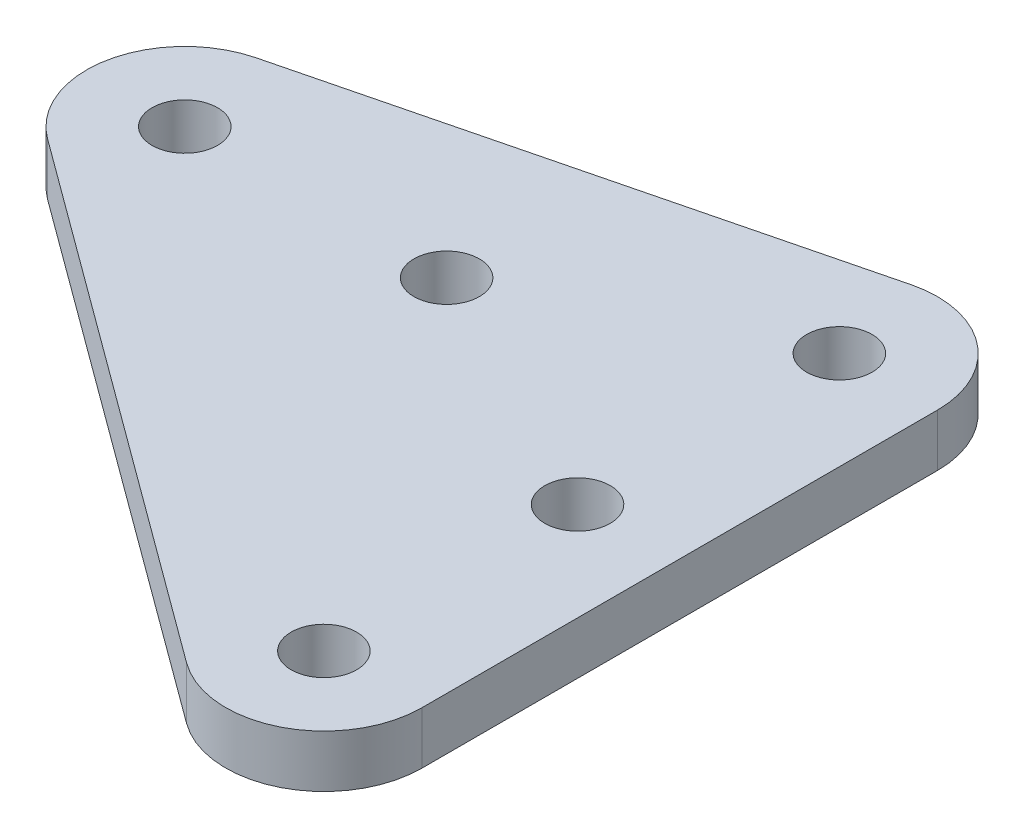
ISO-10303-21;
HEADER;
FILE_DESCRIPTION(('STEP AP214'),'2;1');
FILE_NAME('part.step','',(''),(''),'','','');
FILE_SCHEMA(('AUTOMOTIVE_DESIGN { 1 0 10303 214 1 1 1 1 }'));
ENDSEC;
DATA;
#1=APPLICATION_CONTEXT('core data for automotive mechanical design processes');
#2=APPLICATION_PROTOCOL_DEFINITION('international standard','automotive_design',2000,#1);
#3=PRODUCT_CONTEXT('',#1,'mechanical');
#4=PRODUCT('Part','Part','',(#3));
#5=PRODUCT_RELATED_PRODUCT_CATEGORY('part','',(#4));
#6=PRODUCT_DEFINITION_FORMATION('','',#4);
#7=PRODUCT_DEFINITION_CONTEXT('part definition',#1,'design');
#8=PRODUCT_DEFINITION('design','',#6,#7);
#9=PRODUCT_DEFINITION_SHAPE('','',#8);
#10=(LENGTH_UNIT() NAMED_UNIT(*) SI_UNIT(.MILLI.,.METRE.));
#11=(NAMED_UNIT(*) PLANE_ANGLE_UNIT() SI_UNIT($,.RADIAN.));
#12=(NAMED_UNIT(*) SI_UNIT($,.STERADIAN.) SOLID_ANGLE_UNIT());
#13=UNCERTAINTY_MEASURE_WITH_UNIT(LENGTH_MEASURE(1.E-05),#10,'distance_accuracy_value','');
#14=(GEOMETRIC_REPRESENTATION_CONTEXT(3) GLOBAL_UNCERTAINTY_ASSIGNED_CONTEXT((#13)) GLOBAL_UNIT_ASSIGNED_CONTEXT((#10,
#11,#12)) REPRESENTATION_CONTEXT('',''));
#15=CARTESIAN_POINT('',(0.,0.,0.));
#16=DIRECTION('',(0.,0.,1.));
#17=DIRECTION('',(1.,0.,0.));
#18=AXIS2_PLACEMENT_3D('',#15,#16,#17);
#19=CARTESIAN_POINT('',(13.5400431139798,4.,-19.6875573394978));
#20=DIRECTION('',(0.,1.,0.));
#21=DIRECTION('',(0.,0.,1.));
#22=AXIS2_PLACEMENT_3D('',#19,#20,#21);
#23=PLANE('',#22);
#24=CARTESIAN_POINT('',(13.5400431139798,4.,0.312442660502191));
#25=DIRECTION('',(0.,1.,0.));
#26=DIRECTION('',(0.,0.,-1.));
#27=AXIS2_PLACEMENT_3D('',#24,#25,#26);
#28=CIRCLE('',#27,2.5);
#29=CARTESIAN_POINT('',(13.5400431139798,4.,-2.1875573394978));
#30=VERTEX_POINT('',#29);
#31=EDGE_CURVE('E196',#30,#30,#28,.T.);
#32=ORIENTED_EDGE('',*,*,#31,.F.);
#33=EDGE_LOOP('',(#32));
#34=FACE_BOUND('',#33,.T.);
#35=CARTESIAN_POINT('',(-6.45995688602022,4.,-9.6875573394978));
#36=DIRECTION('',(0.,1.,0.));
#37=DIRECTION('',(0.,0.,1.));
#38=AXIS2_PLACEMENT_3D('',#35,#36,#37);
#39=CIRCLE('',#38,2.50000000000001);
#40=CARTESIAN_POINT('',(-6.45995688602022,4.,-7.1875573394978));
#41=VERTEX_POINT('',#40);
#42=EDGE_CURVE('E208',#41,#41,#39,.T.);
#43=ORIENTED_EDGE('',*,*,#42,.F.);
#44=EDGE_LOOP('',(#43));
#45=FACE_BOUND('',#44,.T.);
#46=CARTESIAN_POINT('',(13.5400431139798,4.,-19.6875573394978));
#47=DIRECTION('',(0.,1.,0.));
#48=DIRECTION('',(0.,0.,1.));
#49=AXIS2_PLACEMENT_3D('',#46,#47,#48);
#50=CIRCLE('',#49,7.50000000000003);
#51=CARTESIAN_POINT('',(21.0400431139798,4.,-19.6875573394978));
#52=VERTEX_POINT('',#51);
#53=CARTESIAN_POINT('',(11.7210259262073,4.,-26.9636260905878));
#54=VERTEX_POINT('',#53);
#55=EDGE_CURVE('E132',#52,#54,#50,.T.);
#56=ORIENTED_EDGE('',*,*,#55,.T.);
#57=DIRECTION('',(-0.970142500145332,0.,0.242535625036333));
#58=VECTOR('',#57,1.);
#59=CARTESIAN_POINT('',(-28.2789740737927,4.,-16.9636260905878));
#60=LINE('',#59,#58);
#61=CARTESIAN_POINT('',(-28.2789740737927,4.,-16.9636260905878));
#62=VERTEX_POINT('',#61);
#63=EDGE_CURVE('E90',#54,#62,#60,.T.);
#64=ORIENTED_EDGE('',*,*,#63,.T.);
#65=CARTESIAN_POINT('',(-26.4599568860202,4.,-9.6875573394978));
#66=DIRECTION('',(0.,1.,0.));
#67=DIRECTION('',(0.,0.,1.));
#68=AXIS2_PLACEMENT_3D('',#65,#66,#67);
#69=CIRCLE('',#68,7.50000000000001);
#70=CARTESIAN_POINT('',(-30.8992894167607,4.,-3.64253238657085));
#71=VERTEX_POINT('',#70);
#72=EDGE_CURVE('E103',#62,#71,#69,.T.);
#73=ORIENTED_EDGE('',*,*,#72,.T.);
#74=DIRECTION('',(0.806003327056926,0.,0.59191100409873));
#75=VECTOR('',#74,1.);
#76=CARTESIAN_POINT('',(-30.8992894167607,4.,-3.64253238657086));
#77=LINE('',#76,#75);
#78=CARTESIAN_POINT('',(9.10071058323932,4.,25.7325822924248));
#79=VERTEX_POINT('',#78);
#80=EDGE_CURVE('E97',#71,#79,#77,.T.);
#81=ORIENTED_EDGE('',*,*,#80,.T.);
#82=CARTESIAN_POINT('',(13.5400431139798,4.,19.6875573394978));
#83=DIRECTION('',(0.,1.,0.));
#84=DIRECTION('',(0.,0.,1.));
#85=AXIS2_PLACEMENT_3D('',#82,#83,#84);
#86=CIRCLE('',#85,7.50000000000001);
#87=CARTESIAN_POINT('',(21.0400431139798,4.,19.6875573394978));
#88=VERTEX_POINT('',#87);
#89=EDGE_CURVE('E101',#79,#88,#86,.T.);
#90=ORIENTED_EDGE('',*,*,#89,.T.);
#91=DIRECTION('',(0.,0.,-1.));
#92=VECTOR('',#91,1.);
#93=CARTESIAN_POINT('',(21.0400431139798,4.,-19.6875573394978));
#94=LINE('',#93,#92);
#95=EDGE_CURVE('E53',#88,#52,#94,.T.);
#96=ORIENTED_EDGE('',*,*,#95,.T.);
#97=EDGE_LOOP('',(#56,#64,#73,#81,#90,#96));
#98=FACE_BOUND('',#97,.T.);
#99=CARTESIAN_POINT('',(-26.4599568860202,4.,-9.6875573394978));
#100=DIRECTION('',(0.,1.,0.));
#101=DIRECTION('',(0.,0.,1.));
#102=AXIS2_PLACEMENT_3D('',#99,#100,#101);
#103=CIRCLE('',#102,2.5);
#104=CARTESIAN_POINT('',(-26.4599568860202,4.,-7.18755733949781));
#105=VERTEX_POINT('',#104);
#106=EDGE_CURVE('E125',#105,#105,#103,.T.);
#107=ORIENTED_EDGE('',*,*,#106,.F.);
#108=EDGE_LOOP('',(#107));
#109=FACE_BOUND('',#108,.T.);
#110=CARTESIAN_POINT('',(13.5400431139798,4.,-19.6875573394978));
#111=DIRECTION('',(0.,1.,0.));
#112=DIRECTION('',(0.,0.,1.));
#113=AXIS2_PLACEMENT_3D('',#110,#111,#112);
#114=CIRCLE('',#113,2.5);
#115=CARTESIAN_POINT('',(13.5400431139798,4.,-17.1875573394978));
#116=VERTEX_POINT('',#115);
#117=EDGE_CURVE('E202',#116,#116,#114,.T.);
#118=ORIENTED_EDGE('',*,*,#117,.F.);
#119=EDGE_LOOP('',(#118));
#120=FACE_BOUND('',#119,.T.);
#121=CARTESIAN_POINT('',(13.5400431139798,4.,19.6875573394978));
#122=DIRECTION('',(0.,1.,0.));
#123=DIRECTION('',(0.,0.,1.));
#124=AXIS2_PLACEMENT_3D('',#121,#122,#123);
#125=CIRCLE('',#124,2.5);
#126=CARTESIAN_POINT('',(13.5400431139798,4.,22.1875573394978));
#127=VERTEX_POINT('',#126);
#128=EDGE_CURVE('E187',#127,#127,#125,.T.);
#129=ORIENTED_EDGE('',*,*,#128,.F.);
#130=EDGE_LOOP('',(#129));
#131=FACE_BOUND('',#130,.T.);
#132=ADVANCED_FACE('F36',(#34,#45,#98,#109,#120,#131),#23,.T.);
#133=CARTESIAN_POINT('',(13.5400431139798,0.,-19.6875573394978));
#134=DIRECTION('',(0.,1.,0.));
#135=DIRECTION('',(0.,0.,1.));
#136=AXIS2_PLACEMENT_3D('',#133,#134,#135);
#137=PLANE('',#136);
#138=CARTESIAN_POINT('',(13.5400431139798,0.,-19.6875573394978));
#139=DIRECTION('',(0.,1.,0.));
#140=DIRECTION('',(0.,0.,1.));
#141=AXIS2_PLACEMENT_3D('',#138,#139,#140);
#142=CIRCLE('',#141,7.50000000000003);
#143=CARTESIAN_POINT('',(21.0400431139798,0.,-19.6875573394978));
#144=VERTEX_POINT('',#143);
#145=CARTESIAN_POINT('',(11.7210259262073,0.,-26.9636260905878));
#146=VERTEX_POINT('',#145);
#147=EDGE_CURVE('E121',#144,#146,#142,.T.);
#148=ORIENTED_EDGE('',*,*,#147,.F.);
#149=DIRECTION('',(0.,0.,-1.));
#150=VECTOR('',#149,1.);
#151=CARTESIAN_POINT('',(21.0400431139798,0.,-19.6875573394978));
#152=LINE('',#151,#150);
#153=CARTESIAN_POINT('',(21.0400431139798,0.,19.6875573394978));
#154=VERTEX_POINT('',#153);
#155=EDGE_CURVE('E82',#154,#144,#152,.T.);
#156=ORIENTED_EDGE('',*,*,#155,.F.);
#157=CARTESIAN_POINT('',(13.5400431139798,0.,19.6875573394978));
#158=DIRECTION('',(0.,1.,0.));
#159=DIRECTION('',(0.,0.,1.));
#160=AXIS2_PLACEMENT_3D('',#157,#158,#159);
#161=CIRCLE('',#160,7.50000000000001);
#162=CARTESIAN_POINT('',(9.10071058323932,0.,25.7325822924248));
#163=VERTEX_POINT('',#162);
#164=EDGE_CURVE('E76',#163,#154,#161,.T.);
#165=ORIENTED_EDGE('',*,*,#164,.F.);
#166=DIRECTION('',(0.806003327056926,0.,0.59191100409873));
#167=VECTOR('',#166,1.);
#168=CARTESIAN_POINT('',(-30.8992894167607,0.,-3.64253238657086));
#169=LINE('',#168,#167);
#170=CARTESIAN_POINT('',(-30.8992894167607,0.,-3.64253238657085));
#171=VERTEX_POINT('',#170);
#172=EDGE_CURVE('E111',#171,#163,#169,.T.);
#173=ORIENTED_EDGE('',*,*,#172,.F.);
#174=CARTESIAN_POINT('',(-26.4599568860202,0.,-9.6875573394978));
#175=DIRECTION('',(0.,1.,0.));
#176=DIRECTION('',(0.,0.,1.));
#177=AXIS2_PLACEMENT_3D('',#174,#175,#176);
#178=CIRCLE('',#177,7.50000000000001);
#179=CARTESIAN_POINT('',(-28.2789740737927,0.,-16.9636260905878));
#180=VERTEX_POINT('',#179);
#181=EDGE_CURVE('E127',#180,#171,#178,.T.);
#182=ORIENTED_EDGE('',*,*,#181,.F.);
#183=DIRECTION('',(-0.970142500145332,0.,0.242535625036333));
#184=VECTOR('',#183,1.);
#185=CARTESIAN_POINT('',(-28.2789740737927,0.,-16.9636260905878));
#186=LINE('',#185,#184);
#187=EDGE_CURVE('E124',#146,#180,#186,.T.);
#188=ORIENTED_EDGE('',*,*,#187,.F.);
#189=EDGE_LOOP('',(#148,#156,#165,#173,#182,#188));
#190=FACE_BOUND('',#189,.T.);
#191=CARTESIAN_POINT('',(-26.4599568860202,0.,-9.6875573394978));
#192=DIRECTION('',(0.,1.,0.));
#193=DIRECTION('',(0.,0.,1.));
#194=AXIS2_PLACEMENT_3D('',#191,#192,#193);
#195=CIRCLE('',#194,2.5);
#196=CARTESIAN_POINT('',(-26.4599568860202,0.,-7.18755733949781));
#197=VERTEX_POINT('',#196);
#198=EDGE_CURVE('E211',#197,#197,#195,.T.);
#199=ORIENTED_EDGE('',*,*,#198,.T.);
#200=EDGE_LOOP('',(#199));
#201=FACE_BOUND('',#200,.T.);
#202=CARTESIAN_POINT('',(-6.45995688602022,0.,-9.6875573394978));
#203=DIRECTION('',(0.,1.,0.));
#204=DIRECTION('',(0.,0.,1.));
#205=AXIS2_PLACEMENT_3D('',#202,#203,#204);
#206=CIRCLE('',#205,2.50000000000001);
#207=CARTESIAN_POINT('',(-6.45995688602022,0.,-7.1875573394978));
#208=VERTEX_POINT('',#207);
#209=EDGE_CURVE('E205',#208,#208,#206,.T.);
#210=ORIENTED_EDGE('',*,*,#209,.T.);
#211=EDGE_LOOP('',(#210));
#212=FACE_BOUND('',#211,.T.);
#213=CARTESIAN_POINT('',(13.5400431139798,0.,-19.6875573394978));
#214=DIRECTION('',(0.,1.,0.));
#215=DIRECTION('',(0.,0.,1.));
#216=AXIS2_PLACEMENT_3D('',#213,#214,#215);
#217=CIRCLE('',#216,2.5);
#218=CARTESIAN_POINT('',(13.5400431139798,0.,-17.1875573394978));
#219=VERTEX_POINT('',#218);
#220=EDGE_CURVE('E199',#219,#219,#217,.T.);
#221=ORIENTED_EDGE('',*,*,#220,.T.);
#222=EDGE_LOOP('',(#221));
#223=FACE_BOUND('',#222,.T.);
#224=CARTESIAN_POINT('',(13.5400431139798,0.,0.312442660502191));
#225=DIRECTION('',(0.,1.,0.));
#226=DIRECTION('',(0.,0.,-1.));
#227=AXIS2_PLACEMENT_3D('',#224,#225,#226);
#228=CIRCLE('',#227,2.5);
#229=CARTESIAN_POINT('',(13.5400431139798,0.,-2.1875573394978));
#230=VERTEX_POINT('',#229);
#231=EDGE_CURVE('E193',#230,#230,#228,.T.);
#232=ORIENTED_EDGE('',*,*,#231,.T.);
#233=EDGE_LOOP('',(#232));
#234=FACE_BOUND('',#233,.T.);
#235=CARTESIAN_POINT('',(13.5400431139798,0.,19.6875573394978));
#236=DIRECTION('',(0.,1.,0.));
#237=DIRECTION('',(0.,0.,1.));
#238=AXIS2_PLACEMENT_3D('',#235,#236,#237);
#239=CIRCLE('',#238,2.5);
#240=CARTESIAN_POINT('',(13.5400431139798,0.,22.1875573394978));
#241=VERTEX_POINT('',#240);
#242=EDGE_CURVE('E190',#241,#241,#239,.T.);
#243=ORIENTED_EDGE('',*,*,#242,.T.);
#244=EDGE_LOOP('',(#243));
#245=FACE_BOUND('',#244,.T.);
#246=ADVANCED_FACE('F141',(#190,#201,#212,#223,#234,#245),#137,.F.);
#247=CARTESIAN_POINT('',(13.5400431139798,4.,-19.6875573394978));
#248=DIRECTION('',(0.,-1.,0.));
#249=DIRECTION('',(0.,0.,-1.));
#250=AXIS2_PLACEMENT_3D('',#247,#248,#249);
#251=CYLINDRICAL_SURFACE('',#250,7.50000000000003);
#252=ORIENTED_EDGE('',*,*,#147,.T.);
#253=DIRECTION('',(0.,-1.,0.));
#254=VECTOR('',#253,1.);
#255=CARTESIAN_POINT('',(11.7210259262073,4.,-26.9636260905878));
#256=LINE('',#255,#254);
#257=EDGE_CURVE('E11',#54,#146,#256,.T.);
#258=ORIENTED_EDGE('',*,*,#257,.F.);
#259=ORIENTED_EDGE('',*,*,#55,.F.);
#260=DIRECTION('',(0.,-1.,0.));
#261=VECTOR('',#260,1.);
#262=CARTESIAN_POINT('',(21.0400431139798,4.,-19.6875573394978));
#263=LINE('',#262,#261);
#264=EDGE_CURVE('E117',#52,#144,#263,.T.);
#265=ORIENTED_EDGE('',*,*,#264,.T.);
#266=EDGE_LOOP('',(#252,#258,#259,#265));
#267=FACE_BOUND('',#266,.T.);
#268=ADVANCED_FACE('F38',(#267),#251,.T.);
#269=CARTESIAN_POINT('',(-28.2789740737927,4.,-16.9636260905878));
#270=DIRECTION('',(0.242535625036333,0.,0.970142500145332));
#271=DIRECTION('',(0.970142500145332,0.,-0.242535625036333));
#272=AXIS2_PLACEMENT_3D('',#269,#270,#271);
#273=PLANE('',#272);
#274=ORIENTED_EDGE('',*,*,#187,.T.);
#275=DIRECTION('',(0.,-1.,0.));
#276=VECTOR('',#275,1.);
#277=CARTESIAN_POINT('',(-28.2789740737927,4.,-16.9636260905878));
#278=LINE('',#277,#276);
#279=EDGE_CURVE('E45',#62,#180,#278,.T.);
#280=ORIENTED_EDGE('',*,*,#279,.F.);
#281=ORIENTED_EDGE('',*,*,#63,.F.);
#282=ORIENTED_EDGE('',*,*,#257,.T.);
#283=EDGE_LOOP('',(#274,#280,#281,#282));
#284=FACE_BOUND('',#283,.T.);
#285=ADVANCED_FACE('F278',(#284),#273,.F.);
#286=CARTESIAN_POINT('',(-26.4599568860202,4.,-9.6875573394978));
#287=DIRECTION('',(0.,-1.,0.));
#288=DIRECTION('',(0.,0.,-1.));
#289=AXIS2_PLACEMENT_3D('',#286,#287,#288);
#290=CYLINDRICAL_SURFACE('',#289,7.50000000000001);
#291=ORIENTED_EDGE('',*,*,#181,.T.);
#292=DIRECTION('',(0.,-1.,0.));
#293=VECTOR('',#292,1.);
#294=CARTESIAN_POINT('',(-30.8992894167607,4.,-3.64253238657085));
#295=LINE('',#294,#293);
#296=EDGE_CURVE('E112',#71,#171,#295,.T.);
#297=ORIENTED_EDGE('',*,*,#296,.F.);
#298=ORIENTED_EDGE('',*,*,#72,.F.);
#299=ORIENTED_EDGE('',*,*,#279,.T.);
#300=EDGE_LOOP('',(#291,#297,#298,#299));
#301=FACE_BOUND('',#300,.T.);
#302=ADVANCED_FACE('F138',(#301),#290,.T.);
#303=CARTESIAN_POINT('',(-30.8992894167607,4.,-3.64253238657086));
#304=DIRECTION('',(0.59191100409873,0.,-0.806003327056925));
#305=DIRECTION('',(-0.806003327056925,0.,-0.59191100409873));
#306=AXIS2_PLACEMENT_3D('',#303,#304,#305);
#307=PLANE('',#306);
#308=ORIENTED_EDGE('',*,*,#172,.T.);
#309=DIRECTION('',(0.,-1.,0.));
#310=VECTOR('',#309,1.);
#311=CARTESIAN_POINT('',(9.10071058323932,4.,25.7325822924248));
#312=LINE('',#311,#310);
#313=EDGE_CURVE('E108',#79,#163,#312,.T.);
#314=ORIENTED_EDGE('',*,*,#313,.F.);
#315=ORIENTED_EDGE('',*,*,#80,.F.);
#316=ORIENTED_EDGE('',*,*,#296,.T.);
#317=EDGE_LOOP('',(#308,#314,#315,#316));
#318=FACE_BOUND('',#317,.T.);
#319=ADVANCED_FACE('F109',(#318),#307,.F.);
#320=CARTESIAN_POINT('',(13.5400431139798,4.,19.6875573394978));
#321=DIRECTION('',(0.,-1.,0.));
#322=DIRECTION('',(0.,0.,-1.));
#323=AXIS2_PLACEMENT_3D('',#320,#321,#322);
#324=CYLINDRICAL_SURFACE('',#323,7.50000000000001);
#325=ORIENTED_EDGE('',*,*,#164,.T.);
#326=DIRECTION('',(0.,-1.,0.));
#327=VECTOR('',#326,1.);
#328=CARTESIAN_POINT('',(21.0400431139798,4.,19.6875573394978));
#329=LINE('',#328,#327);
#330=EDGE_CURVE('E113',#88,#154,#329,.T.);
#331=ORIENTED_EDGE('',*,*,#330,.F.);
#332=ORIENTED_EDGE('',*,*,#89,.F.);
#333=ORIENTED_EDGE('',*,*,#313,.T.);
#334=EDGE_LOOP('',(#325,#331,#332,#333));
#335=FACE_BOUND('',#334,.T.);
#336=ADVANCED_FACE('F115',(#335),#324,.T.);
#337=CARTESIAN_POINT('',(21.0400431139798,4.,-19.6875573394978));
#338=DIRECTION('',(-1.,0.,0.));
#339=DIRECTION('',(0.,0.,1.));
#340=AXIS2_PLACEMENT_3D('',#337,#338,#339);
#341=PLANE('',#340);
#342=ORIENTED_EDGE('',*,*,#155,.T.);
#343=ORIENTED_EDGE('',*,*,#264,.F.);
#344=ORIENTED_EDGE('',*,*,#95,.F.);
#345=ORIENTED_EDGE('',*,*,#330,.T.);
#346=EDGE_LOOP('',(#342,#343,#344,#345));
#347=FACE_BOUND('',#346,.T.);
#348=ADVANCED_FACE('F146',(#347),#341,.F.);
#349=CARTESIAN_POINT('',(-26.4599568860202,4.,-9.6875573394978));
#350=DIRECTION('',(0.,-1.,0.));
#351=DIRECTION('',(0.,0.,-1.));
#352=AXIS2_PLACEMENT_3D('',#349,#350,#351);
#353=CYLINDRICAL_SURFACE('',#352,2.5);
#354=ORIENTED_EDGE('',*,*,#106,.T.);
#355=EDGE_LOOP('',(#354));
#356=FACE_BOUND('',#355,.T.);
#357=ORIENTED_EDGE('',*,*,#198,.F.);
#358=EDGE_LOOP('',(#357));
#359=FACE_BOUND('',#358,.T.);
#360=ADVANCED_FACE('F148',(#356,#359),#353,.F.);
#361=CARTESIAN_POINT('',(-6.45995688602022,4.,-9.6875573394978));
#362=DIRECTION('',(0.,-1.,0.));
#363=DIRECTION('',(0.,0.,-1.));
#364=AXIS2_PLACEMENT_3D('',#361,#362,#363);
#365=CYLINDRICAL_SURFACE('',#364,2.50000000000001);
#366=ORIENTED_EDGE('',*,*,#42,.T.);
#367=EDGE_LOOP('',(#366));
#368=FACE_BOUND('',#367,.T.);
#369=ORIENTED_EDGE('',*,*,#209,.F.);
#370=EDGE_LOOP('',(#369));
#371=FACE_BOUND('',#370,.T.);
#372=ADVANCED_FACE('F154',(#368,#371),#365,.F.);
#373=CARTESIAN_POINT('',(13.5400431139798,4.,-19.6875573394978));
#374=DIRECTION('',(0.,-1.,0.));
#375=DIRECTION('',(0.,0.,-1.));
#376=AXIS2_PLACEMENT_3D('',#373,#374,#375);
#377=CYLINDRICAL_SURFACE('',#376,2.5);
#378=ORIENTED_EDGE('',*,*,#117,.T.);
#379=EDGE_LOOP('',(#378));
#380=FACE_BOUND('',#379,.T.);
#381=ORIENTED_EDGE('',*,*,#220,.F.);
#382=EDGE_LOOP('',(#381));
#383=FACE_BOUND('',#382,.T.);
#384=ADVANCED_FACE('F170',(#380,#383),#377,.F.);
#385=CARTESIAN_POINT('',(13.5400431139798,4.,0.312442660502191));
#386=DIRECTION('',(0.,-1.,0.));
#387=DIRECTION('',(0.,0.,-1.));
#388=AXIS2_PLACEMENT_3D('',#385,#386,#387);
#389=CYLINDRICAL_SURFACE('',#388,2.5);
#390=ORIENTED_EDGE('',*,*,#31,.T.);
#391=EDGE_LOOP('',(#390));
#392=FACE_BOUND('',#391,.T.);
#393=ORIENTED_EDGE('',*,*,#231,.F.);
#394=EDGE_LOOP('',(#393));
#395=FACE_BOUND('',#394,.T.);
#396=ADVANCED_FACE('F174',(#392,#395),#389,.F.);
#397=CARTESIAN_POINT('',(13.5400431139798,4.,19.6875573394978));
#398=DIRECTION('',(0.,-1.,0.));
#399=DIRECTION('',(0.,0.,-1.));
#400=AXIS2_PLACEMENT_3D('',#397,#398,#399);
#401=CYLINDRICAL_SURFACE('',#400,2.5);
#402=ORIENTED_EDGE('',*,*,#128,.T.);
#403=EDGE_LOOP('',(#402));
#404=FACE_BOUND('',#403,.T.);
#405=ORIENTED_EDGE('',*,*,#242,.F.);
#406=EDGE_LOOP('',(#405));
#407=FACE_BOUND('',#406,.T.);
#408=ADVANCED_FACE('F178',(#404,#407),#401,.F.);
#409=CLOSED_SHELL('',(#132,#246,#268,#285,#302,#319,#336,#348,#360,#372,#384,#396,#408));
#410=MANIFOLD_SOLID_BREP('B2',#409);
#411=ADVANCED_BREP_SHAPE_REPRESENTATION('',(#18,#410),#14);
#412=SHAPE_DEFINITION_REPRESENTATION(#9,#411);
ENDSEC;
END-ISO-10303-21;
